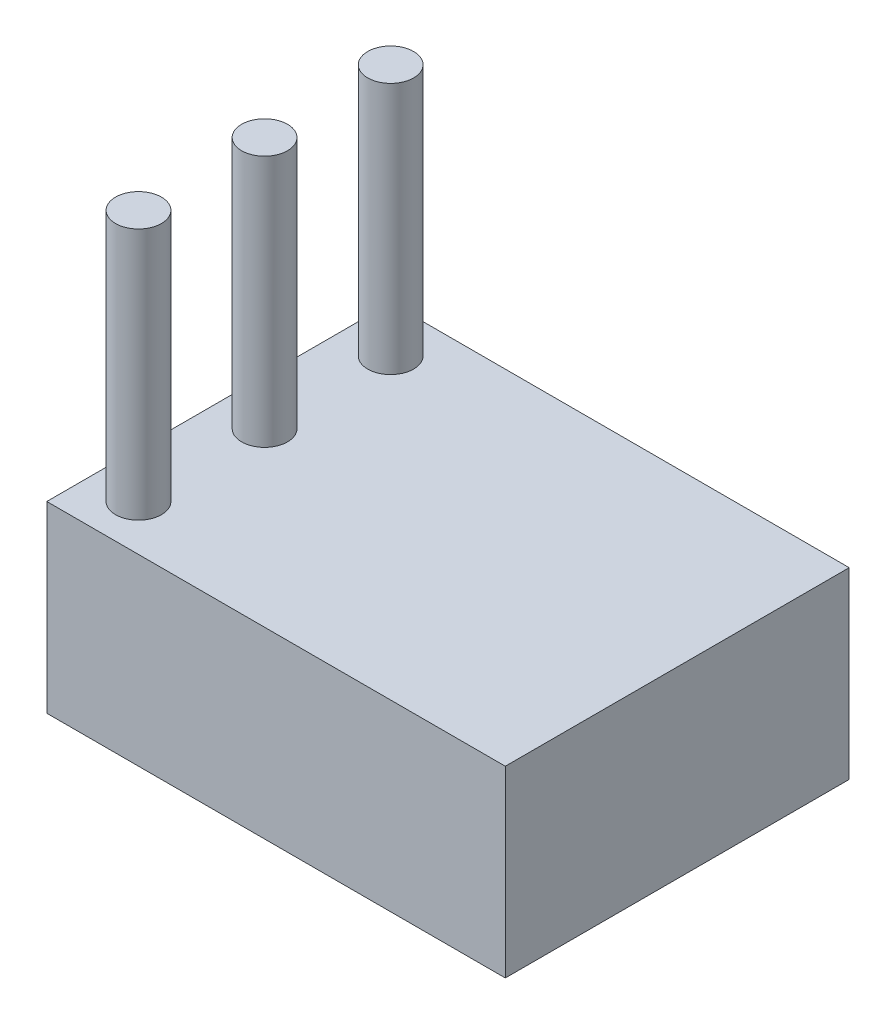
ISO-10303-21;
HEADER;
FILE_DESCRIPTION(('STEP AP214'),'2;1');
FILE_NAME('part.step','',(''),(''),'','','');
FILE_SCHEMA(('AUTOMOTIVE_DESIGN { 1 0 10303 214 1 1 1 1 }'));
ENDSEC;
DATA;
#1=APPLICATION_CONTEXT('core data for automotive mechanical design processes');
#2=APPLICATION_PROTOCOL_DEFINITION('international standard','automotive_design',2000,#1);
#3=PRODUCT_CONTEXT('',#1,'mechanical');
#4=PRODUCT('Part','Part','',(#3));
#5=PRODUCT_RELATED_PRODUCT_CATEGORY('part','',(#4));
#6=PRODUCT_DEFINITION_FORMATION('','',#4);
#7=PRODUCT_DEFINITION_CONTEXT('part definition',#1,'design');
#8=PRODUCT_DEFINITION('design','',#6,#7);
#9=PRODUCT_DEFINITION_SHAPE('','',#8);
#10=(LENGTH_UNIT() NAMED_UNIT(*) SI_UNIT(.MILLI.,.METRE.));
#11=(NAMED_UNIT(*) PLANE_ANGLE_UNIT() SI_UNIT($,.RADIAN.));
#12=(NAMED_UNIT(*) SI_UNIT($,.STERADIAN.) SOLID_ANGLE_UNIT());
#13=UNCERTAINTY_MEASURE_WITH_UNIT(LENGTH_MEASURE(1.E-05),#10,'distance_accuracy_value','');
#14=(GEOMETRIC_REPRESENTATION_CONTEXT(3) GLOBAL_UNCERTAINTY_ASSIGNED_CONTEXT((#13)) GLOBAL_UNIT_ASSIGNED_CONTEXT((#10,
#11,#12)) REPRESENTATION_CONTEXT('',''));
#15=CARTESIAN_POINT('',(0.,0.,0.));
#16=DIRECTION('',(0.,0.,1.));
#17=DIRECTION('',(1.,0.,0.));
#18=AXIS2_PLACEMENT_3D('',#15,#16,#17);
#19=CARTESIAN_POINT('',(25.4,20.32,19.05));
#20=DIRECTION('',(-1.,0.,0.));
#21=DIRECTION('',(0.,0.,1.));
#22=AXIS2_PLACEMENT_3D('',#19,#20,#21);
#23=PLANE('',#22);
#24=DIRECTION('',(0.,0.,-1.));
#25=VECTOR('',#24,1.);
#26=CARTESIAN_POINT('',(25.4,0.,19.05));
#27=LINE('',#26,#25);
#28=CARTESIAN_POINT('',(25.4,0.,19.05));
#29=VERTEX_POINT('',#28);
#30=CARTESIAN_POINT('',(25.4,0.,-19.05));
#31=VERTEX_POINT('',#30);
#32=EDGE_CURVE('E104',#29,#31,#27,.T.);
#33=ORIENTED_EDGE('',*,*,#32,.T.);
#34=DIRECTION('',(0.,-1.,0.));
#35=VECTOR('',#34,1.);
#36=CARTESIAN_POINT('',(25.4,20.32,-19.05));
#37=LINE('',#36,#35);
#38=CARTESIAN_POINT('',(25.4,20.32,-19.05));
#39=VERTEX_POINT('',#38);
#40=EDGE_CURVE('E95',#39,#31,#37,.T.);
#41=ORIENTED_EDGE('',*,*,#40,.F.);
#42=DIRECTION('',(0.,0.,-1.));
#43=VECTOR('',#42,1.);
#44=CARTESIAN_POINT('',(25.4,20.32,19.05));
#45=LINE('',#44,#43);
#46=CARTESIAN_POINT('',(25.4,20.32,19.05));
#47=VERTEX_POINT('',#46);
#48=EDGE_CURVE('E89',#47,#39,#45,.T.);
#49=ORIENTED_EDGE('',*,*,#48,.F.);
#50=DIRECTION('',(0.,-1.,0.));
#51=VECTOR('',#50,1.);
#52=CARTESIAN_POINT('',(25.4,20.32,19.05));
#53=LINE('',#52,#51);
#54=EDGE_CURVE('E100',#47,#29,#53,.T.);
#55=ORIENTED_EDGE('',*,*,#54,.T.);
#56=EDGE_LOOP('',(#33,#41,#49,#55));
#57=FACE_BOUND('',#56,.T.);
#58=ADVANCED_FACE('F37',(#57),#23,.F.);
#59=CARTESIAN_POINT('',(-25.4,20.32,-19.05));
#60=DIRECTION('',(0.,0.,1.));
#61=DIRECTION('',(1.,0.,0.));
#62=AXIS2_PLACEMENT_3D('',#59,#60,#61);
#63=PLANE('',#62);
#64=DIRECTION('',(-1.,0.,0.));
#65=VECTOR('',#64,1.);
#66=CARTESIAN_POINT('',(-25.4,0.,-19.05));
#67=LINE('',#66,#65);
#68=CARTESIAN_POINT('',(-25.4,0.,-19.05));
#69=VERTEX_POINT('',#68);
#70=EDGE_CURVE('E94',#31,#69,#67,.T.);
#71=ORIENTED_EDGE('',*,*,#70,.T.);
#72=DIRECTION('',(0.,-1.,0.));
#73=VECTOR('',#72,1.);
#74=CARTESIAN_POINT('',(-25.4,20.32,-19.05));
#75=LINE('',#74,#73);
#76=CARTESIAN_POINT('',(-25.4,20.32,-19.05));
#77=VERTEX_POINT('',#76);
#78=EDGE_CURVE('E92',#77,#69,#75,.T.);
#79=ORIENTED_EDGE('',*,*,#78,.F.);
#80=DIRECTION('',(-1.,0.,0.));
#81=VECTOR('',#80,1.);
#82=CARTESIAN_POINT('',(-25.4,20.32,-19.05));
#83=LINE('',#82,#81);
#84=EDGE_CURVE('E84',#39,#77,#83,.T.);
#85=ORIENTED_EDGE('',*,*,#84,.F.);
#86=ORIENTED_EDGE('',*,*,#40,.T.);
#87=EDGE_LOOP('',(#71,#79,#85,#86));
#88=FACE_BOUND('',#87,.T.);
#89=ADVANCED_FACE('F93',(#88),#63,.F.);
#90=CARTESIAN_POINT('',(-25.4,20.32,19.05));
#91=DIRECTION('',(1.,0.,0.));
#92=DIRECTION('',(0.,0.,-1.));
#93=AXIS2_PLACEMENT_3D('',#90,#91,#92);
#94=PLANE('',#93);
#95=DIRECTION('',(0.,0.,1.));
#96=VECTOR('',#95,1.);
#97=CARTESIAN_POINT('',(-25.4,0.,19.05));
#98=LINE('',#97,#96);
#99=CARTESIAN_POINT('',(-25.4,0.,19.05));
#100=VERTEX_POINT('',#99);
#101=EDGE_CURVE('E70',#69,#100,#98,.T.);
#102=ORIENTED_EDGE('',*,*,#101,.T.);
#103=DIRECTION('',(0.,-1.,0.));
#104=VECTOR('',#103,1.);
#105=CARTESIAN_POINT('',(-25.4,20.32,19.05));
#106=LINE('',#105,#104);
#107=CARTESIAN_POINT('',(-25.4,20.32,19.05));
#108=VERTEX_POINT('',#107);
#109=EDGE_CURVE('E96',#108,#100,#106,.T.);
#110=ORIENTED_EDGE('',*,*,#109,.F.);
#111=DIRECTION('',(0.,0.,1.));
#112=VECTOR('',#111,1.);
#113=CARTESIAN_POINT('',(-25.4,20.32,19.05));
#114=LINE('',#113,#112);
#115=EDGE_CURVE('E87',#77,#108,#114,.T.);
#116=ORIENTED_EDGE('',*,*,#115,.F.);
#117=ORIENTED_EDGE('',*,*,#78,.T.);
#118=EDGE_LOOP('',(#102,#110,#116,#117));
#119=FACE_BOUND('',#118,.T.);
#120=ADVANCED_FACE('F98',(#119),#94,.F.);
#121=CARTESIAN_POINT('',(-25.4,20.32,19.05));
#122=DIRECTION('',(0.,0.,-1.));
#123=DIRECTION('',(-1.,0.,0.));
#124=AXIS2_PLACEMENT_3D('',#121,#122,#123);
#125=PLANE('',#124);
#126=DIRECTION('',(1.,0.,0.));
#127=VECTOR('',#126,1.);
#128=CARTESIAN_POINT('',(-25.4,0.,19.05));
#129=LINE('',#128,#127);
#130=EDGE_CURVE('E76',#100,#29,#129,.T.);
#131=ORIENTED_EDGE('',*,*,#130,.T.);
#132=ORIENTED_EDGE('',*,*,#54,.F.);
#133=DIRECTION('',(1.,0.,0.));
#134=VECTOR('',#133,1.);
#135=CARTESIAN_POINT('',(-25.4,20.32,19.05));
#136=LINE('',#135,#134);
#137=EDGE_CURVE('E53',#108,#47,#136,.T.);
#138=ORIENTED_EDGE('',*,*,#137,.F.);
#139=ORIENTED_EDGE('',*,*,#109,.T.);
#140=EDGE_LOOP('',(#131,#132,#138,#139));
#141=FACE_BOUND('',#140,.T.);
#142=ADVANCED_FACE('F124',(#141),#125,.F.);
#143=CARTESIAN_POINT('',(0.,20.32,0.));
#144=DIRECTION('',(0.,-1.,0.));
#145=DIRECTION('',(0.,0.,-1.));
#146=AXIS2_PLACEMENT_3D('',#143,#144,#145);
#147=PLANE('',#146);
#148=CARTESIAN_POINT('',(-20.32,20.32,0.));
#149=DIRECTION('',(0.,-1.,0.));
#150=DIRECTION('',(0.,0.,-1.));
#151=AXIS2_PLACEMENT_3D('',#148,#149,#150);
#152=CIRCLE('',#151,2.54);
#153=CARTESIAN_POINT('',(-20.32,20.32,-2.54000000000001));
#154=VERTEX_POINT('',#153);
#155=EDGE_CURVE('E11',#154,#154,#152,.F.);
#156=ORIENTED_EDGE('',*,*,#155,.F.);
#157=EDGE_LOOP('',(#156));
#158=FACE_BOUND('',#157,.T.);
#159=CARTESIAN_POINT('',(-20.32,20.32,13.97));
#160=DIRECTION('',(0.,-1.,0.));
#161=DIRECTION('',(0.,0.,-1.));
#162=AXIS2_PLACEMENT_3D('',#159,#160,#161);
#163=CIRCLE('',#162,2.54);
#164=CARTESIAN_POINT('',(-20.32,20.32,11.43));
#165=VERTEX_POINT('',#164);
#166=EDGE_CURVE('E45',#165,#165,#163,.F.);
#167=ORIENTED_EDGE('',*,*,#166,.F.);
#168=EDGE_LOOP('',(#167));
#169=FACE_BOUND('',#168,.T.);
#170=CARTESIAN_POINT('',(-20.32,20.32,-13.97));
#171=DIRECTION('',(0.,-1.,0.));
#172=DIRECTION('',(0.,0.,-1.));
#173=AXIS2_PLACEMENT_3D('',#170,#171,#172);
#174=CIRCLE('',#173,2.54);
#175=CARTESIAN_POINT('',(-20.32,20.32,-16.51));
#176=VERTEX_POINT('',#175);
#177=EDGE_CURVE('E114',#176,#176,#174,.F.);
#178=ORIENTED_EDGE('',*,*,#177,.F.);
#179=EDGE_LOOP('',(#178));
#180=FACE_BOUND('',#179,.T.);
#181=ORIENTED_EDGE('',*,*,#48,.T.);
#182=ORIENTED_EDGE('',*,*,#84,.T.);
#183=ORIENTED_EDGE('',*,*,#115,.T.);
#184=ORIENTED_EDGE('',*,*,#137,.T.);
#185=EDGE_LOOP('',(#181,#182,#183,#184));
#186=FACE_BOUND('',#185,.T.);
#187=ADVANCED_FACE('F85',(#158,#169,#180,#186),#147,.F.);
#188=CARTESIAN_POINT('',(0.,0.,0.));
#189=DIRECTION('',(0.,-1.,0.));
#190=DIRECTION('',(0.,0.,-1.));
#191=AXIS2_PLACEMENT_3D('',#188,#189,#190);
#192=PLANE('',#191);
#193=ORIENTED_EDGE('',*,*,#32,.F.);
#194=ORIENTED_EDGE('',*,*,#130,.F.);
#195=ORIENTED_EDGE('',*,*,#101,.F.);
#196=ORIENTED_EDGE('',*,*,#70,.F.);
#197=EDGE_LOOP('',(#193,#194,#195,#196));
#198=FACE_BOUND('',#197,.T.);
#199=ADVANCED_FACE('F123',(#198),#192,.T.);
#200=CARTESIAN_POINT('',(-20.32,48.26,-13.97));
#201=DIRECTION('',(0.,-1.,0.));
#202=DIRECTION('',(0.,0.,-1.));
#203=AXIS2_PLACEMENT_3D('',#200,#201,#202);
#204=CYLINDRICAL_SURFACE('',#203,2.54);
#205=CARTESIAN_POINT('',(-20.32,48.26,-13.97));
#206=DIRECTION('',(0.,1.,0.));
#207=DIRECTION('',(0.,0.,1.));
#208=AXIS2_PLACEMENT_3D('',#205,#206,#207);
#209=CIRCLE('',#208,2.54);
#210=CARTESIAN_POINT('',(-20.32,48.26,-11.43));
#211=VERTEX_POINT('',#210);
#212=EDGE_CURVE('E107',#211,#211,#209,.T.);
#213=ORIENTED_EDGE('',*,*,#212,.F.);
#214=EDGE_LOOP('',(#213));
#215=FACE_BOUND('',#214,.T.);
#216=ORIENTED_EDGE('',*,*,#177,.T.);
#217=EDGE_LOOP('',(#216));
#218=FACE_BOUND('',#217,.T.);
#219=ADVANCED_FACE('F129',(#215,#218),#204,.T.);
#220=CARTESIAN_POINT('',(-20.32,48.26,-13.97));
#221=DIRECTION('',(0.,1.,0.));
#222=DIRECTION('',(0.,0.,1.));
#223=AXIS2_PLACEMENT_3D('',#220,#221,#222);
#224=PLANE('',#223);
#225=ORIENTED_EDGE('',*,*,#212,.T.);
#226=EDGE_LOOP('',(#225));
#227=FACE_BOUND('',#226,.T.);
#228=ADVANCED_FACE('F131',(#227),#224,.T.);
#229=CARTESIAN_POINT('',(-20.32,48.26,13.97));
#230=DIRECTION('',(0.,-1.,0.));
#231=DIRECTION('',(0.,0.,-1.));
#232=AXIS2_PLACEMENT_3D('',#229,#230,#231);
#233=CYLINDRICAL_SURFACE('',#232,2.54);
#234=CARTESIAN_POINT('',(-20.32,48.26,13.97));
#235=DIRECTION('',(0.,1.,0.));
#236=DIRECTION('',(0.,0.,-1.));
#237=AXIS2_PLACEMENT_3D('',#234,#235,#236);
#238=CIRCLE('',#237,2.54);
#239=CARTESIAN_POINT('',(-20.32,48.26,11.43));
#240=VERTEX_POINT('',#239);
#241=EDGE_CURVE('E237',#240,#240,#238,.T.);
#242=ORIENTED_EDGE('',*,*,#241,.F.);
#243=EDGE_LOOP('',(#242));
#244=FACE_BOUND('',#243,.T.);
#245=ORIENTED_EDGE('',*,*,#166,.T.);
#246=EDGE_LOOP('',(#245));
#247=FACE_BOUND('',#246,.T.);
#248=ADVANCED_FACE('F119',(#244,#247),#233,.T.);
#249=CARTESIAN_POINT('',(-20.32,48.26,13.97));
#250=DIRECTION('',(0.,-1.,0.));
#251=DIRECTION('',(0.,0.,-1.));
#252=AXIS2_PLACEMENT_3D('',#249,#250,#251);
#253=PLANE('',#252);
#254=ORIENTED_EDGE('',*,*,#241,.T.);
#255=EDGE_LOOP('',(#254));
#256=FACE_BOUND('',#255,.T.);
#257=ADVANCED_FACE('F200',(#256),#253,.F.);
#258=CARTESIAN_POINT('',(-20.32,48.26,0.));
#259=DIRECTION('',(0.,-1.,0.));
#260=DIRECTION('',(0.,0.,-1.));
#261=AXIS2_PLACEMENT_3D('',#258,#259,#260);
#262=CYLINDRICAL_SURFACE('',#261,2.54);
#263=CARTESIAN_POINT('',(-20.32,48.26,0.));
#264=DIRECTION('',(0.,1.,0.));
#265=DIRECTION('',(0.,0.,1.));
#266=AXIS2_PLACEMENT_3D('',#263,#264,#265);
#267=CIRCLE('',#266,2.54);
#268=CARTESIAN_POINT('',(-20.32,48.26,2.54));
#269=VERTEX_POINT('',#268);
#270=EDGE_CURVE('E236',#269,#269,#267,.T.);
#271=ORIENTED_EDGE('',*,*,#270,.F.);
#272=EDGE_LOOP('',(#271));
#273=FACE_BOUND('',#272,.T.);
#274=ORIENTED_EDGE('',*,*,#155,.T.);
#275=EDGE_LOOP('',(#274));
#276=FACE_BOUND('',#275,.T.);
#277=ADVANCED_FACE('F209',(#273,#276),#262,.T.);
#278=CARTESIAN_POINT('',(-20.32,48.26,0.));
#279=DIRECTION('',(0.,1.,0.));
#280=DIRECTION('',(0.,0.,1.));
#281=AXIS2_PLACEMENT_3D('',#278,#279,#280);
#282=PLANE('',#281);
#283=ORIENTED_EDGE('',*,*,#270,.T.);
#284=EDGE_LOOP('',(#283));
#285=FACE_BOUND('',#284,.T.);
#286=ADVANCED_FACE('F218',(#285),#282,.T.);
#287=CLOSED_SHELL('',(#58,#89,#120,#142,#187,#199,#219,#228,#248,#257,#277,#286));
#288=MANIFOLD_SOLID_BREP('B2',#287);
#289=ADVANCED_BREP_SHAPE_REPRESENTATION('',(#18,#288),#14);
#290=SHAPE_DEFINITION_REPRESENTATION(#9,#289);
ENDSEC;
END-ISO-10303-21;
